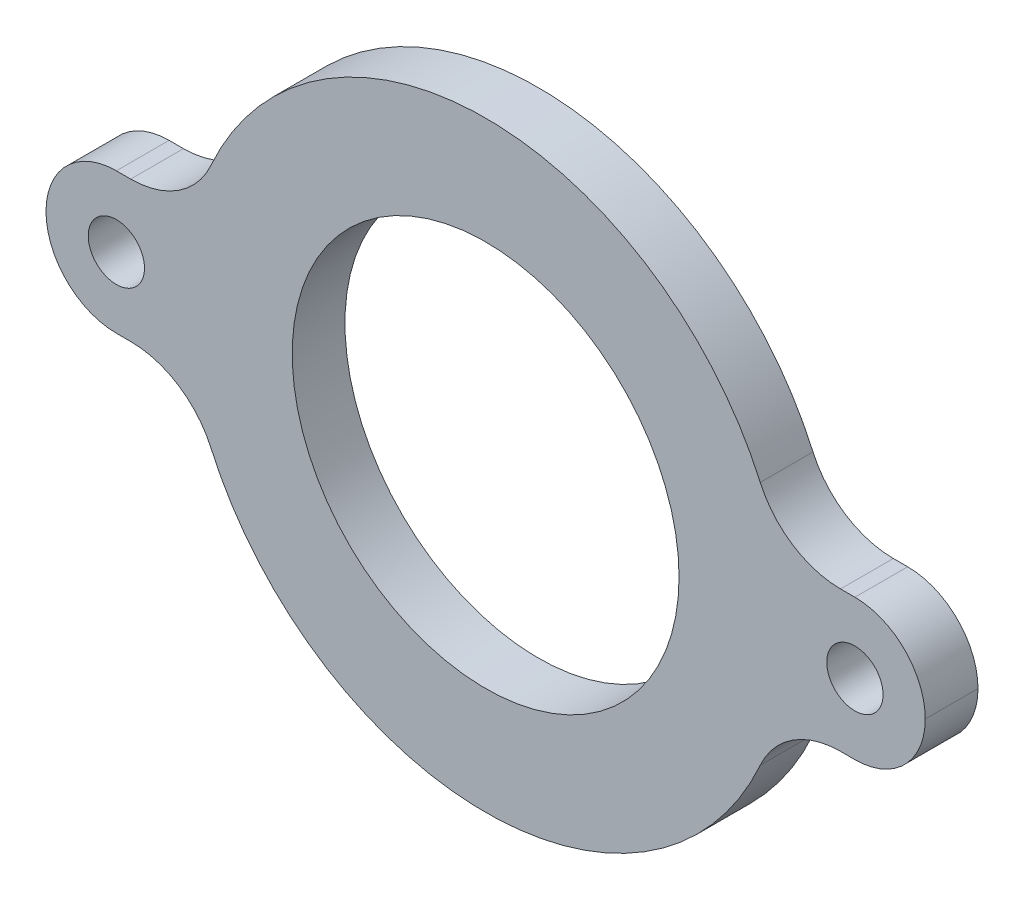
ISO-10303-21;
HEADER;
FILE_DESCRIPTION(('STEP AP214'),'2;1');
FILE_NAME('part.step','',(''),(''),'','','');
FILE_SCHEMA(('AUTOMOTIVE_DESIGN { 1 0 10303 214 1 1 1 1 }'));
ENDSEC;
DATA;
#1=APPLICATION_CONTEXT('core data for automotive mechanical design processes');
#2=APPLICATION_PROTOCOL_DEFINITION('international standard','automotive_design',2000,#1);
#3=PRODUCT_CONTEXT('',#1,'mechanical');
#4=PRODUCT('Part','Part','',(#3));
#5=PRODUCT_RELATED_PRODUCT_CATEGORY('part','',(#4));
#6=PRODUCT_DEFINITION_FORMATION('','',#4);
#7=PRODUCT_DEFINITION_CONTEXT('part definition',#1,'design');
#8=PRODUCT_DEFINITION('design','',#6,#7);
#9=PRODUCT_DEFINITION_SHAPE('','',#8);
#10=(LENGTH_UNIT() NAMED_UNIT(*) SI_UNIT(.MILLI.,.METRE.));
#11=(NAMED_UNIT(*) PLANE_ANGLE_UNIT() SI_UNIT($,.RADIAN.));
#12=(NAMED_UNIT(*) SI_UNIT($,.STERADIAN.) SOLID_ANGLE_UNIT());
#13=UNCERTAINTY_MEASURE_WITH_UNIT(LENGTH_MEASURE(1.E-05),#10,'distance_accuracy_value','');
#14=(GEOMETRIC_REPRESENTATION_CONTEXT(3) GLOBAL_UNCERTAINTY_ASSIGNED_CONTEXT((#13)) GLOBAL_UNIT_ASSIGNED_CONTEXT((#10,
#11,#12)) REPRESENTATION_CONTEXT('',''));
#15=CARTESIAN_POINT('',(0.,0.,0.));
#16=DIRECTION('',(0.,0.,1.));
#17=DIRECTION('',(1.,0.,0.));
#18=AXIS2_PLACEMENT_3D('',#15,#16,#17);
#19=CARTESIAN_POINT('',(0.,0.,3.));
#20=DIRECTION('',(0.,0.,-1.));
#21=DIRECTION('',(-1.,0.,0.));
#22=AXIS2_PLACEMENT_3D('',#19,#20,#21);
#23=PLANE('',#22);
#24=DIRECTION('',(1.,0.,0.));
#25=VECTOR('',#24,1.);
#26=CARTESIAN_POINT('',(25.,-4.,3.));
#27=LINE('',#26,#25);
#28=CARTESIAN_POINT('',(20.1843999167674,-4.,3.));
#29=VERTEX_POINT('',#28);
#30=CARTESIAN_POINT('',(21.,-4.,3.));
#31=VERTEX_POINT('',#30);
#32=EDGE_CURVE('E256',#29,#31,#27,.T.);
#33=ORIENTED_EDGE('',*,*,#32,.T.);
#34=CARTESIAN_POINT('',(21.,0.,3.));
#35=DIRECTION('',(0.,0.,-1.));
#36=DIRECTION('',(-1.,0.,0.));
#37=AXIS2_PLACEMENT_3D('',#34,#35,#36);
#38=CIRCLE('',#37,4.);
#39=CARTESIAN_POINT('',(25.,0.,3.));
#40=VERTEX_POINT('',#39);
#41=EDGE_CURVE('E222',#31,#40,#38,.F.);
#42=ORIENTED_EDGE('',*,*,#41,.T.);
#43=CARTESIAN_POINT('',(21.,0.,3.));
#44=DIRECTION('',(0.,0.,-1.));
#45=DIRECTION('',(-1.,0.,0.));
#46=AXIS2_PLACEMENT_3D('',#43,#44,#45);
#47=CIRCLE('',#46,4.);
#48=CARTESIAN_POINT('',(21.,4.,3.));
#49=VERTEX_POINT('',#48);
#50=EDGE_CURVE('E60',#40,#49,#47,.F.);
#51=ORIENTED_EDGE('',*,*,#50,.T.);
#52=DIRECTION('',(-1.,0.,0.));
#53=VECTOR('',#52,1.);
#54=CARTESIAN_POINT('',(25.,4.,3.));
#55=LINE('',#54,#53);
#56=CARTESIAN_POINT('',(20.1843999167674,4.,3.));
#57=VERTEX_POINT('',#56);
#58=EDGE_CURVE('E253',#49,#57,#55,.T.);
#59=ORIENTED_EDGE('',*,*,#58,.T.);
#60=CARTESIAN_POINT('',(20.1843999167674,9.,3.));
#61=DIRECTION('',(0.,0.,-1.));
#62=DIRECTION('',(-1.,0.,0.));
#63=AXIS2_PLACEMENT_3D('',#60,#61,#62);
#64=CIRCLE('',#63,5.);
#65=CARTESIAN_POINT('',(15.6177936007567,6.96380090497737,3.));
#66=VERTEX_POINT('',#65);
#67=EDGE_CURVE('E151',#57,#66,#64,.T.);
#68=ORIENTED_EDGE('',*,*,#67,.T.);
#69=CARTESIAN_POINT('',(0.,0.,3.));
#70=DIRECTION('',(0.,0.,1.));
#71=DIRECTION('',(-1.,0.,0.));
#72=AXIS2_PLACEMENT_3D('',#69,#70,#71);
#73=CIRCLE('',#72,17.1);
#74=CARTESIAN_POINT('',(-15.6177936007567,6.96380090497737,3.));
#75=VERTEX_POINT('',#74);
#76=EDGE_CURVE('E161',#66,#75,#73,.T.);
#77=ORIENTED_EDGE('',*,*,#76,.T.);
#78=CARTESIAN_POINT('',(-20.1843999167674,9.,3.));
#79=DIRECTION('',(0.,0.,-1.));
#80=DIRECTION('',(-1.,0.,0.));
#81=AXIS2_PLACEMENT_3D('',#78,#79,#80);
#82=CIRCLE('',#81,5.);
#83=CARTESIAN_POINT('',(-20.1843999167674,4.,3.));
#84=VERTEX_POINT('',#83);
#85=EDGE_CURVE('E204',#75,#84,#82,.T.);
#86=ORIENTED_EDGE('',*,*,#85,.T.);
#87=DIRECTION('',(-1.,0.,0.));
#88=VECTOR('',#87,1.);
#89=CARTESIAN_POINT('',(-25.,4.,3.));
#90=LINE('',#89,#88);
#91=CARTESIAN_POINT('',(-21.,4.,3.));
#92=VERTEX_POINT('',#91);
#93=EDGE_CURVE('E177',#84,#92,#90,.T.);
#94=ORIENTED_EDGE('',*,*,#93,.T.);
#95=CARTESIAN_POINT('',(-21.,0.,3.));
#96=DIRECTION('',(0.,0.,-1.));
#97=DIRECTION('',(-1.,0.,0.));
#98=AXIS2_PLACEMENT_3D('',#95,#96,#97);
#99=CIRCLE('',#98,4.);
#100=CARTESIAN_POINT('',(-25.,0.,3.));
#101=VERTEX_POINT('',#100);
#102=EDGE_CURVE('E217',#92,#101,#99,.F.);
#103=ORIENTED_EDGE('',*,*,#102,.T.);
#104=CARTESIAN_POINT('',(-21.,0.,3.));
#105=DIRECTION('',(0.,0.,-1.));
#106=DIRECTION('',(-1.,0.,0.));
#107=AXIS2_PLACEMENT_3D('',#104,#105,#106);
#108=CIRCLE('',#107,4.);
#109=CARTESIAN_POINT('',(-21.,-4.,3.));
#110=VERTEX_POINT('',#109);
#111=EDGE_CURVE('E219',#101,#110,#108,.F.);
#112=ORIENTED_EDGE('',*,*,#111,.T.);
#113=DIRECTION('',(1.,0.,0.));
#114=VECTOR('',#113,1.);
#115=CARTESIAN_POINT('',(-25.,-4.,3.));
#116=LINE('',#115,#114);
#117=CARTESIAN_POINT('',(-20.1843999167674,-4.,3.));
#118=VERTEX_POINT('',#117);
#119=EDGE_CURVE('E171',#110,#118,#116,.T.);
#120=ORIENTED_EDGE('',*,*,#119,.T.);
#121=CARTESIAN_POINT('',(-20.1843999167674,-9.,3.));
#122=DIRECTION('',(0.,0.,-1.));
#123=DIRECTION('',(-1.,0.,0.));
#124=AXIS2_PLACEMENT_3D('',#121,#122,#123);
#125=CIRCLE('',#124,5.);
#126=CARTESIAN_POINT('',(-15.6177936007567,-6.96380090497737,3.));
#127=VERTEX_POINT('',#126);
#128=EDGE_CURVE('E201',#118,#127,#125,.T.);
#129=ORIENTED_EDGE('',*,*,#128,.T.);
#130=CARTESIAN_POINT('',(0.,0.,3.));
#131=DIRECTION('',(0.,0.,1.));
#132=DIRECTION('',(1.,0.,0.));
#133=AXIS2_PLACEMENT_3D('',#130,#131,#132);
#134=CIRCLE('',#133,17.1);
#135=CARTESIAN_POINT('',(15.6177936007567,-6.96380090497737,3.));
#136=VERTEX_POINT('',#135);
#137=EDGE_CURVE('E326',#127,#136,#134,.T.);
#138=ORIENTED_EDGE('',*,*,#137,.T.);
#139=CARTESIAN_POINT('',(20.1843999167674,-9.,3.));
#140=DIRECTION('',(0.,0.,-1.));
#141=DIRECTION('',(-1.,0.,0.));
#142=AXIS2_PLACEMENT_3D('',#139,#140,#141);
#143=CIRCLE('',#142,5.);
#144=EDGE_CURVE('E196',#136,#29,#143,.T.);
#145=ORIENTED_EDGE('',*,*,#144,.T.);
#146=EDGE_LOOP('',(#33,#42,#51,#59,#68,#77,#86,#94,#103,#112,#120,#129,#138,#145));
#147=FACE_BOUND('',#146,.T.);
#148=CARTESIAN_POINT('',(0.,0.,3.));
#149=DIRECTION('',(0.,0.,1.));
#150=DIRECTION('',(1.,0.,0.));
#151=AXIS2_PLACEMENT_3D('',#148,#149,#150);
#152=CIRCLE('',#151,11.);
#153=CARTESIAN_POINT('',(11.,0.,3.));
#154=VERTEX_POINT('',#153);
#155=EDGE_CURVE('E263',#154,#154,#152,.T.);
#156=ORIENTED_EDGE('',*,*,#155,.F.);
#157=EDGE_LOOP('',(#156));
#158=FACE_BOUND('',#157,.T.);
#159=CARTESIAN_POINT('',(-21.,0.,3.));
#160=DIRECTION('',(0.,0.,1.));
#161=DIRECTION('',(1.,0.,0.));
#162=AXIS2_PLACEMENT_3D('',#159,#160,#161);
#163=CIRCLE('',#162,1.6);
#164=CARTESIAN_POINT('',(-19.4,0.,3.));
#165=VERTEX_POINT('',#164);
#166=EDGE_CURVE('E317',#165,#165,#163,.T.);
#167=ORIENTED_EDGE('',*,*,#166,.F.);
#168=EDGE_LOOP('',(#167));
#169=FACE_BOUND('',#168,.T.);
#170=CARTESIAN_POINT('',(21.,0.,3.));
#171=DIRECTION('',(0.,0.,1.));
#172=DIRECTION('',(1.,0.,0.));
#173=AXIS2_PLACEMENT_3D('',#170,#171,#172);
#174=CIRCLE('',#173,1.6);
#175=CARTESIAN_POINT('',(22.6,0.,3.));
#176=VERTEX_POINT('',#175);
#177=EDGE_CURVE('E234',#176,#176,#174,.T.);
#178=ORIENTED_EDGE('',*,*,#177,.F.);
#179=EDGE_LOOP('',(#178));
#180=FACE_BOUND('',#179,.T.);
#181=ADVANCED_FACE('F37',(#147,#158,#169,#180),#23,.F.);
#182=CARTESIAN_POINT('',(0.,0.,0.));
#183=DIRECTION('',(0.,0.,-1.));
#184=DIRECTION('',(-1.,0.,0.));
#185=AXIS2_PLACEMENT_3D('',#182,#183,#184);
#186=PLANE('',#185);
#187=CARTESIAN_POINT('',(-21.,0.,0.));
#188=DIRECTION('',(0.,0.,1.));
#189=DIRECTION('',(1.,0.,0.));
#190=AXIS2_PLACEMENT_3D('',#187,#188,#189);
#191=CIRCLE('',#190,1.6);
#192=CARTESIAN_POINT('',(-19.4,0.,0.));
#193=VERTEX_POINT('',#192);
#194=EDGE_CURVE('E321',#193,#193,#191,.T.);
#195=ORIENTED_EDGE('',*,*,#194,.T.);
#196=EDGE_LOOP('',(#195));
#197=FACE_BOUND('',#196,.T.);
#198=CARTESIAN_POINT('',(21.,0.,0.));
#199=DIRECTION('',(0.,0.,-1.));
#200=DIRECTION('',(-1.,0.,0.));
#201=AXIS2_PLACEMENT_3D('',#198,#199,#200);
#202=CIRCLE('',#201,4.);
#203=CARTESIAN_POINT('',(21.,4.,0.));
#204=VERTEX_POINT('',#203);
#205=CARTESIAN_POINT('',(25.,0.,0.));
#206=VERTEX_POINT('',#205);
#207=EDGE_CURVE('E210',#204,#206,#202,.T.);
#208=ORIENTED_EDGE('',*,*,#207,.T.);
#209=CARTESIAN_POINT('',(21.,0.,0.));
#210=DIRECTION('',(0.,0.,-1.));
#211=DIRECTION('',(-1.,0.,0.));
#212=AXIS2_PLACEMENT_3D('',#209,#210,#211);
#213=CIRCLE('',#212,4.);
#214=CARTESIAN_POINT('',(21.,-4.,0.));
#215=VERTEX_POINT('',#214);
#216=EDGE_CURVE('E212',#206,#215,#213,.T.);
#217=ORIENTED_EDGE('',*,*,#216,.T.);
#218=DIRECTION('',(1.,0.,0.));
#219=VECTOR('',#218,1.);
#220=CARTESIAN_POINT('',(25.,-4.,0.));
#221=LINE('',#220,#219);
#222=CARTESIAN_POINT('',(20.1843999167674,-4.,0.));
#223=VERTEX_POINT('',#222);
#224=EDGE_CURVE('E173',#223,#215,#221,.T.);
#225=ORIENTED_EDGE('',*,*,#224,.F.);
#226=CARTESIAN_POINT('',(20.1843999167674,-9.,0.));
#227=DIRECTION('',(0.,0.,-1.));
#228=DIRECTION('',(-1.,0.,0.));
#229=AXIS2_PLACEMENT_3D('',#226,#227,#228);
#230=CIRCLE('',#229,5.);
#231=CARTESIAN_POINT('',(15.6177936007567,-6.96380090497737,0.));
#232=VERTEX_POINT('',#231);
#233=EDGE_CURVE('E194',#223,#232,#230,.F.);
#234=ORIENTED_EDGE('',*,*,#233,.T.);
#235=CARTESIAN_POINT('',(0.,0.,0.));
#236=DIRECTION('',(0.,0.,1.));
#237=DIRECTION('',(1.,0.,0.));
#238=AXIS2_PLACEMENT_3D('',#235,#236,#237);
#239=CIRCLE('',#238,17.1);
#240=CARTESIAN_POINT('',(-15.6177936007567,-6.96380090497737,0.));
#241=VERTEX_POINT('',#240);
#242=EDGE_CURVE('E262',#241,#232,#239,.T.);
#243=ORIENTED_EDGE('',*,*,#242,.F.);
#244=CARTESIAN_POINT('',(-20.1843999167674,-9.,0.));
#245=DIRECTION('',(0.,0.,-1.));
#246=DIRECTION('',(-1.,0.,0.));
#247=AXIS2_PLACEMENT_3D('',#244,#245,#246);
#248=CIRCLE('',#247,5.);
#249=CARTESIAN_POINT('',(-20.1843999167674,-4.,0.));
#250=VERTEX_POINT('',#249);
#251=EDGE_CURVE('E198',#241,#250,#248,.F.);
#252=ORIENTED_EDGE('',*,*,#251,.T.);
#253=DIRECTION('',(1.,0.,0.));
#254=VECTOR('',#253,1.);
#255=CARTESIAN_POINT('',(-25.,-4.,0.));
#256=LINE('',#255,#254);
#257=CARTESIAN_POINT('',(-21.,-4.,0.));
#258=VERTEX_POINT('',#257);
#259=EDGE_CURVE('E260',#258,#250,#256,.T.);
#260=ORIENTED_EDGE('',*,*,#259,.F.);
#261=CARTESIAN_POINT('',(-21.,0.,0.));
#262=DIRECTION('',(0.,0.,-1.));
#263=DIRECTION('',(-1.,0.,0.));
#264=AXIS2_PLACEMENT_3D('',#261,#262,#263);
#265=CIRCLE('',#264,4.);
#266=CARTESIAN_POINT('',(-25.,0.,0.));
#267=VERTEX_POINT('',#266);
#268=EDGE_CURVE('E208',#258,#267,#265,.T.);
#269=ORIENTED_EDGE('',*,*,#268,.T.);
#270=CARTESIAN_POINT('',(-21.,0.,0.));
#271=DIRECTION('',(0.,0.,-1.));
#272=DIRECTION('',(-1.,0.,0.));
#273=AXIS2_PLACEMENT_3D('',#270,#271,#272);
#274=CIRCLE('',#273,4.);
#275=CARTESIAN_POINT('',(-21.,4.,0.));
#276=VERTEX_POINT('',#275);
#277=EDGE_CURVE('E206',#267,#276,#274,.T.);
#278=ORIENTED_EDGE('',*,*,#277,.T.);
#279=DIRECTION('',(-1.,0.,0.));
#280=VECTOR('',#279,1.);
#281=CARTESIAN_POINT('',(-25.,4.,0.));
#282=LINE('',#281,#280);
#283=CARTESIAN_POINT('',(-20.1843999167674,4.,0.));
#284=VERTEX_POINT('',#283);
#285=EDGE_CURVE('E168',#284,#276,#282,.T.);
#286=ORIENTED_EDGE('',*,*,#285,.F.);
#287=CARTESIAN_POINT('',(-20.1843999167674,9.,0.));
#288=DIRECTION('',(0.,0.,-1.));
#289=DIRECTION('',(-1.,0.,0.));
#290=AXIS2_PLACEMENT_3D('',#287,#288,#289);
#291=CIRCLE('',#290,5.);
#292=CARTESIAN_POINT('',(-15.6177936007567,6.96380090497737,0.));
#293=VERTEX_POINT('',#292);
#294=EDGE_CURVE('E167',#284,#293,#291,.F.);
#295=ORIENTED_EDGE('',*,*,#294,.T.);
#296=CARTESIAN_POINT('',(0.,0.,0.));
#297=DIRECTION('',(0.,0.,1.));
#298=DIRECTION('',(-1.,0.,0.));
#299=AXIS2_PLACEMENT_3D('',#296,#297,#298);
#300=CIRCLE('',#299,17.1);
#301=CARTESIAN_POINT('',(15.6177936007567,6.96380090497737,0.));
#302=VERTEX_POINT('',#301);
#303=EDGE_CURVE('E158',#302,#293,#300,.T.);
#304=ORIENTED_EDGE('',*,*,#303,.F.);
#305=CARTESIAN_POINT('',(20.1843999167674,9.,0.));
#306=DIRECTION('',(0.,0.,-1.));
#307=DIRECTION('',(-1.,0.,0.));
#308=AXIS2_PLACEMENT_3D('',#305,#306,#307);
#309=CIRCLE('',#308,5.);
#310=CARTESIAN_POINT('',(20.1843999167674,4.,0.));
#311=VERTEX_POINT('',#310);
#312=EDGE_CURVE('E141',#302,#311,#309,.F.);
#313=ORIENTED_EDGE('',*,*,#312,.T.);
#314=DIRECTION('',(-1.,0.,0.));
#315=VECTOR('',#314,1.);
#316=CARTESIAN_POINT('',(25.,4.,0.));
#317=LINE('',#316,#315);
#318=EDGE_CURVE('E169',#204,#311,#317,.T.);
#319=ORIENTED_EDGE('',*,*,#318,.F.);
#320=EDGE_LOOP('',(#208,#217,#225,#234,#243,#252,#260,#269,#278,#286,#295,#304,#313,#319));
#321=FACE_BOUND('',#320,.T.);
#322=CARTESIAN_POINT('',(0.,0.,0.));
#323=DIRECTION('',(0.,0.,1.));
#324=DIRECTION('',(1.,0.,0.));
#325=AXIS2_PLACEMENT_3D('',#322,#323,#324);
#326=CIRCLE('',#325,11.);
#327=CARTESIAN_POINT('',(11.,0.,0.));
#328=VERTEX_POINT('',#327);
#329=EDGE_CURVE('E316',#328,#328,#326,.T.);
#330=ORIENTED_EDGE('',*,*,#329,.T.);
#331=EDGE_LOOP('',(#330));
#332=FACE_BOUND('',#331,.T.);
#333=CARTESIAN_POINT('',(21.,0.,0.));
#334=DIRECTION('',(0.,0.,1.));
#335=DIRECTION('',(1.,0.,0.));
#336=AXIS2_PLACEMENT_3D('',#333,#334,#335);
#337=CIRCLE('',#336,1.6);
#338=CARTESIAN_POINT('',(22.6,0.,0.));
#339=VERTEX_POINT('',#338);
#340=EDGE_CURVE('E229',#339,#339,#337,.T.);
#341=ORIENTED_EDGE('',*,*,#340,.T.);
#342=EDGE_LOOP('',(#341));
#343=FACE_BOUND('',#342,.T.);
#344=ADVANCED_FACE('F164',(#197,#321,#332,#343),#186,.T.);
#345=CARTESIAN_POINT('',(-25.,-4.,3.));
#346=DIRECTION('',(0.,1.,0.));
#347=DIRECTION('',(0.,0.,1.));
#348=AXIS2_PLACEMENT_3D('',#345,#346,#347);
#349=PLANE('',#348);
#350=ORIENTED_EDGE('',*,*,#119,.F.);
#351=DIRECTION('',(0.,0.,-1.));
#352=VECTOR('',#351,1.);
#353=CARTESIAN_POINT('',(-21.,-4.,3.));
#354=LINE('',#353,#352);
#355=EDGE_CURVE('E46',#110,#258,#354,.T.);
#356=ORIENTED_EDGE('',*,*,#355,.T.);
#357=ORIENTED_EDGE('',*,*,#259,.T.);
#358=DIRECTION('',(0.,0.,1.));
#359=VECTOR('',#358,1.);
#360=CARTESIAN_POINT('',(-20.1843999167674,-4.,3.));
#361=LINE('',#360,#359);
#362=EDGE_CURVE('E188',#250,#118,#361,.T.);
#363=ORIENTED_EDGE('',*,*,#362,.T.);
#364=EDGE_LOOP('',(#350,#356,#357,#363));
#365=FACE_BOUND('',#364,.T.);
#366=ADVANCED_FACE('F293',(#365),#349,.F.);
#367=CARTESIAN_POINT('',(0.,0.,3.));
#368=DIRECTION('',(0.,0.,-1.));
#369=DIRECTION('',(-1.,0.,0.));
#370=AXIS2_PLACEMENT_3D('',#367,#368,#369);
#371=CYLINDRICAL_SURFACE('',#370,17.1);
#372=ORIENTED_EDGE('',*,*,#242,.T.);
#373=DIRECTION('',(0.,0.,-1.));
#374=VECTOR('',#373,1.);
#375=CARTESIAN_POINT('',(15.6177936007567,-6.96380090497738,3.));
#376=LINE('',#375,#374);
#377=EDGE_CURVE('E186',#232,#136,#376,.F.);
#378=ORIENTED_EDGE('',*,*,#377,.T.);
#379=ORIENTED_EDGE('',*,*,#137,.F.);
#380=DIRECTION('',(0.,0.,-1.));
#381=VECTOR('',#380,1.);
#382=CARTESIAN_POINT('',(-15.6177936007567,-6.96380090497738,3.));
#383=LINE('',#382,#381);
#384=EDGE_CURVE('E183',#127,#241,#383,.T.);
#385=ORIENTED_EDGE('',*,*,#384,.T.);
#386=EDGE_LOOP('',(#372,#378,#379,#385));
#387=FACE_BOUND('',#386,.T.);
#388=ADVANCED_FACE('F286',(#387),#371,.T.);
#389=CARTESIAN_POINT('',(25.,-4.,3.));
#390=DIRECTION('',(0.,1.,0.));
#391=DIRECTION('',(0.,0.,1.));
#392=AXIS2_PLACEMENT_3D('',#389,#390,#391);
#393=PLANE('',#392);
#394=ORIENTED_EDGE('',*,*,#224,.T.);
#395=DIRECTION('',(0.,0.,-1.));
#396=VECTOR('',#395,1.);
#397=CARTESIAN_POINT('',(21.,-4.,3.));
#398=LINE('',#397,#396);
#399=EDGE_CURVE('E214',#215,#31,#398,.F.);
#400=ORIENTED_EDGE('',*,*,#399,.T.);
#401=ORIENTED_EDGE('',*,*,#32,.F.);
#402=DIRECTION('',(0.,0.,1.));
#403=VECTOR('',#402,1.);
#404=CARTESIAN_POINT('',(20.1843999167674,-4.,0.));
#405=LINE('',#404,#403);
#406=EDGE_CURVE('E180',#29,#223,#405,.F.);
#407=ORIENTED_EDGE('',*,*,#406,.T.);
#408=EDGE_LOOP('',(#394,#400,#401,#407));
#409=FACE_BOUND('',#408,.T.);
#410=ADVANCED_FACE('F269',(#409),#393,.F.);
#411=CARTESIAN_POINT('',(25.,4.,3.));
#412=DIRECTION('',(0.,-1.,0.));
#413=DIRECTION('',(0.,0.,-1.));
#414=AXIS2_PLACEMENT_3D('',#411,#412,#413);
#415=PLANE('',#414);
#416=ORIENTED_EDGE('',*,*,#58,.F.);
#417=DIRECTION('',(0.,0.,-1.));
#418=VECTOR('',#417,1.);
#419=CARTESIAN_POINT('',(21.,4.,3.));
#420=LINE('',#419,#418);
#421=EDGE_CURVE('E224',#49,#204,#420,.T.);
#422=ORIENTED_EDGE('',*,*,#421,.T.);
#423=ORIENTED_EDGE('',*,*,#318,.T.);
#424=DIRECTION('',(0.,0.,1.));
#425=VECTOR('',#424,1.);
#426=CARTESIAN_POINT('',(20.1843999167674,4.,3.));
#427=LINE('',#426,#425);
#428=EDGE_CURVE('E147',#311,#57,#427,.T.);
#429=ORIENTED_EDGE('',*,*,#428,.T.);
#430=EDGE_LOOP('',(#416,#422,#423,#429));
#431=FACE_BOUND('',#430,.T.);
#432=ADVANCED_FACE('F278',(#431),#415,.F.);
#433=CARTESIAN_POINT('',(0.,0.,3.));
#434=DIRECTION('',(0.,0.,-1.));
#435=DIRECTION('',(-1.,0.,0.));
#436=AXIS2_PLACEMENT_3D('',#433,#434,#435);
#437=CYLINDRICAL_SURFACE('',#436,17.1);
#438=ORIENTED_EDGE('',*,*,#76,.F.);
#439=DIRECTION('',(0.,0.,-1.));
#440=VECTOR('',#439,1.);
#441=CARTESIAN_POINT('',(15.6177936007567,6.96380090497738,3.));
#442=LINE('',#441,#440);
#443=EDGE_CURVE('E145',#66,#302,#442,.T.);
#444=ORIENTED_EDGE('',*,*,#443,.T.);
#445=ORIENTED_EDGE('',*,*,#303,.T.);
#446=DIRECTION('',(0.,0.,-1.));
#447=VECTOR('',#446,1.);
#448=CARTESIAN_POINT('',(-15.6177936007567,6.96380090497738,3.));
#449=LINE('',#448,#447);
#450=EDGE_CURVE('E162',#293,#75,#449,.F.);
#451=ORIENTED_EDGE('',*,*,#450,.T.);
#452=EDGE_LOOP('',(#438,#444,#445,#451));
#453=FACE_BOUND('',#452,.T.);
#454=ADVANCED_FACE('F157',(#453),#437,.T.);
#455=CARTESIAN_POINT('',(-25.,4.,3.));
#456=DIRECTION('',(0.,-1.,0.));
#457=DIRECTION('',(0.,0.,-1.));
#458=AXIS2_PLACEMENT_3D('',#455,#456,#457);
#459=PLANE('',#458);
#460=ORIENTED_EDGE('',*,*,#285,.T.);
#461=DIRECTION('',(0.,0.,-1.));
#462=VECTOR('',#461,1.);
#463=CARTESIAN_POINT('',(-21.,4.,3.));
#464=LINE('',#463,#462);
#465=EDGE_CURVE('E11',#276,#92,#464,.F.);
#466=ORIENTED_EDGE('',*,*,#465,.T.);
#467=ORIENTED_EDGE('',*,*,#93,.F.);
#468=DIRECTION('',(0.,0.,1.));
#469=VECTOR('',#468,1.);
#470=CARTESIAN_POINT('',(-20.1843999167674,4.,0.));
#471=LINE('',#470,#469);
#472=EDGE_CURVE('E152',#84,#284,#471,.F.);
#473=ORIENTED_EDGE('',*,*,#472,.T.);
#474=EDGE_LOOP('',(#460,#466,#467,#473));
#475=FACE_BOUND('',#474,.T.);
#476=ADVANCED_FACE('F246',(#475),#459,.F.);
#477=CARTESIAN_POINT('',(0.,0.,3.));
#478=DIRECTION('',(0.,0.,-1.));
#479=DIRECTION('',(-1.,0.,0.));
#480=AXIS2_PLACEMENT_3D('',#477,#478,#479);
#481=CYLINDRICAL_SURFACE('',#480,11.);
#482=ORIENTED_EDGE('',*,*,#155,.T.);
#483=EDGE_LOOP('',(#482));
#484=FACE_BOUND('',#483,.T.);
#485=ORIENTED_EDGE('',*,*,#329,.F.);
#486=EDGE_LOOP('',(#485));
#487=FACE_BOUND('',#486,.T.);
#488=ADVANCED_FACE('F297',(#484,#487),#481,.F.);
#489=CARTESIAN_POINT('',(-21.,0.,3.));
#490=DIRECTION('',(0.,0.,-1.));
#491=DIRECTION('',(-1.,0.,0.));
#492=AXIS2_PLACEMENT_3D('',#489,#490,#491);
#493=CYLINDRICAL_SURFACE('',#492,1.6);
#494=ORIENTED_EDGE('',*,*,#166,.T.);
#495=EDGE_LOOP('',(#494));
#496=FACE_BOUND('',#495,.T.);
#497=ORIENTED_EDGE('',*,*,#194,.F.);
#498=EDGE_LOOP('',(#497));
#499=FACE_BOUND('',#498,.T.);
#500=ADVANCED_FACE('F304',(#496,#499),#493,.F.);
#501=CARTESIAN_POINT('',(21.,0.,3.));
#502=DIRECTION('',(0.,0.,-1.));
#503=DIRECTION('',(-1.,0.,0.));
#504=AXIS2_PLACEMENT_3D('',#501,#502,#503);
#505=CYLINDRICAL_SURFACE('',#504,1.6);
#506=ORIENTED_EDGE('',*,*,#177,.T.);
#507=EDGE_LOOP('',(#506));
#508=FACE_BOUND('',#507,.T.);
#509=ORIENTED_EDGE('',*,*,#340,.F.);
#510=EDGE_LOOP('',(#509));
#511=FACE_BOUND('',#510,.T.);
#512=ADVANCED_FACE('F309',(#508,#511),#505,.F.);
#513=CARTESIAN_POINT('',(20.1843999167674,9.,3.));
#514=DIRECTION('',(0.,0.,-1.));
#515=DIRECTION('',(-1.,0.,0.));
#516=AXIS2_PLACEMENT_3D('',#513,#514,#515);
#517=CYLINDRICAL_SURFACE('',#516,5.);
#518=ORIENTED_EDGE('',*,*,#67,.F.);
#519=ORIENTED_EDGE('',*,*,#428,.F.);
#520=ORIENTED_EDGE('',*,*,#312,.F.);
#521=ORIENTED_EDGE('',*,*,#443,.F.);
#522=EDGE_LOOP('',(#518,#519,#520,#521));
#523=FACE_BOUND('',#522,.T.);
#524=ADVANCED_FACE('F144',(#523),#517,.F.);
#525=CARTESIAN_POINT('',(20.1843999167674,-9.,3.));
#526=DIRECTION('',(0.,0.,-1.));
#527=DIRECTION('',(-1.,0.,0.));
#528=AXIS2_PLACEMENT_3D('',#525,#526,#527);
#529=CYLINDRICAL_SURFACE('',#528,5.);
#530=ORIENTED_EDGE('',*,*,#144,.F.);
#531=ORIENTED_EDGE('',*,*,#377,.F.);
#532=ORIENTED_EDGE('',*,*,#233,.F.);
#533=ORIENTED_EDGE('',*,*,#406,.F.);
#534=EDGE_LOOP('',(#530,#531,#532,#533));
#535=FACE_BOUND('',#534,.T.);
#536=ADVANCED_FACE('F335',(#535),#529,.F.);
#537=CARTESIAN_POINT('',(-20.1843999167674,-9.,3.));
#538=DIRECTION('',(0.,0.,-1.));
#539=DIRECTION('',(-1.,0.,0.));
#540=AXIS2_PLACEMENT_3D('',#537,#538,#539);
#541=CYLINDRICAL_SURFACE('',#540,5.);
#542=ORIENTED_EDGE('',*,*,#128,.F.);
#543=ORIENTED_EDGE('',*,*,#362,.F.);
#544=ORIENTED_EDGE('',*,*,#251,.F.);
#545=ORIENTED_EDGE('',*,*,#384,.F.);
#546=EDGE_LOOP('',(#542,#543,#544,#545));
#547=FACE_BOUND('',#546,.T.);
#548=ADVANCED_FACE('F338',(#547),#541,.F.);
#549=CARTESIAN_POINT('',(-20.1843999167674,9.,3.));
#550=DIRECTION('',(0.,0.,-1.));
#551=DIRECTION('',(-1.,0.,0.));
#552=AXIS2_PLACEMENT_3D('',#549,#550,#551);
#553=CYLINDRICAL_SURFACE('',#552,5.);
#554=ORIENTED_EDGE('',*,*,#85,.F.);
#555=ORIENTED_EDGE('',*,*,#450,.F.);
#556=ORIENTED_EDGE('',*,*,#294,.F.);
#557=ORIENTED_EDGE('',*,*,#472,.F.);
#558=EDGE_LOOP('',(#554,#555,#556,#557));
#559=FACE_BOUND('',#558,.T.);
#560=ADVANCED_FACE('F250',(#559),#553,.F.);
#561=CARTESIAN_POINT('',(21.,0.,3.));
#562=DIRECTION('',(0.,0.,-1.));
#563=DIRECTION('',(-1.,0.,0.));
#564=AXIS2_PLACEMENT_3D('',#561,#562,#563);
#565=CYLINDRICAL_SURFACE('',#564,4.);
#566=ORIENTED_EDGE('',*,*,#421,.F.);
#567=ORIENTED_EDGE('',*,*,#50,.F.);
#568=DIRECTION('',(0.,0.,-1.));
#569=VECTOR('',#568,1.);
#570=CARTESIAN_POINT('',(25.,0.,3.));
#571=LINE('',#570,#569);
#572=EDGE_CURVE('E227',#206,#40,#571,.F.);
#573=ORIENTED_EDGE('',*,*,#572,.F.);
#574=ORIENTED_EDGE('',*,*,#207,.F.);
#575=EDGE_LOOP('',(#566,#567,#573,#574));
#576=FACE_BOUND('',#575,.T.);
#577=ADVANCED_FACE('F275',(#576),#565,.T.);
#578=CARTESIAN_POINT('',(21.,0.,3.));
#579=DIRECTION('',(0.,0.,-1.));
#580=DIRECTION('',(-1.,0.,0.));
#581=AXIS2_PLACEMENT_3D('',#578,#579,#580);
#582=CYLINDRICAL_SURFACE('',#581,4.);
#583=ORIENTED_EDGE('',*,*,#41,.F.);
#584=ORIENTED_EDGE('',*,*,#399,.F.);
#585=ORIENTED_EDGE('',*,*,#216,.F.);
#586=ORIENTED_EDGE('',*,*,#572,.T.);
#587=EDGE_LOOP('',(#583,#584,#585,#586));
#588=FACE_BOUND('',#587,.T.);
#589=ADVANCED_FACE('F272',(#588),#582,.T.);
#590=CARTESIAN_POINT('',(-21.,0.,3.));
#591=DIRECTION('',(0.,0.,-1.));
#592=DIRECTION('',(-1.,0.,0.));
#593=AXIS2_PLACEMENT_3D('',#590,#591,#592);
#594=CYLINDRICAL_SURFACE('',#593,4.);
#595=DIRECTION('',(0.,0.,-1.));
#596=VECTOR('',#595,1.);
#597=CARTESIAN_POINT('',(-25.,0.,3.));
#598=LINE('',#597,#596);
#599=EDGE_CURVE('E41',#101,#267,#598,.T.);
#600=ORIENTED_EDGE('',*,*,#599,.F.);
#601=ORIENTED_EDGE('',*,*,#102,.F.);
#602=ORIENTED_EDGE('',*,*,#465,.F.);
#603=ORIENTED_EDGE('',*,*,#277,.F.);
#604=EDGE_LOOP('',(#600,#601,#602,#603));
#605=FACE_BOUND('',#604,.T.);
#606=ADVANCED_FACE('F39',(#605),#594,.T.);
#607=CARTESIAN_POINT('',(-21.,0.,3.));
#608=DIRECTION('',(0.,0.,-1.));
#609=DIRECTION('',(-1.,0.,0.));
#610=AXIS2_PLACEMENT_3D('',#607,#608,#609);
#611=CYLINDRICAL_SURFACE('',#610,4.);
#612=ORIENTED_EDGE('',*,*,#111,.F.);
#613=ORIENTED_EDGE('',*,*,#599,.T.);
#614=ORIENTED_EDGE('',*,*,#268,.F.);
#615=ORIENTED_EDGE('',*,*,#355,.F.);
#616=EDGE_LOOP('',(#612,#613,#614,#615));
#617=FACE_BOUND('',#616,.T.);
#618=ADVANCED_FACE('F240',(#617),#611,.T.);
#619=CLOSED_SHELL('',(#181,#344,#366,#388,#410,#432,#454,#476,#488,#500,#512,#524,#536,#548,
#560,#577,#589,#606,#618));
#620=MANIFOLD_SOLID_BREP('B2',#619);
#621=ADVANCED_BREP_SHAPE_REPRESENTATION('',(#18,#620),#14);
#622=SHAPE_DEFINITION_REPRESENTATION(#9,#621);
ENDSEC;
END-ISO-10303-21;
